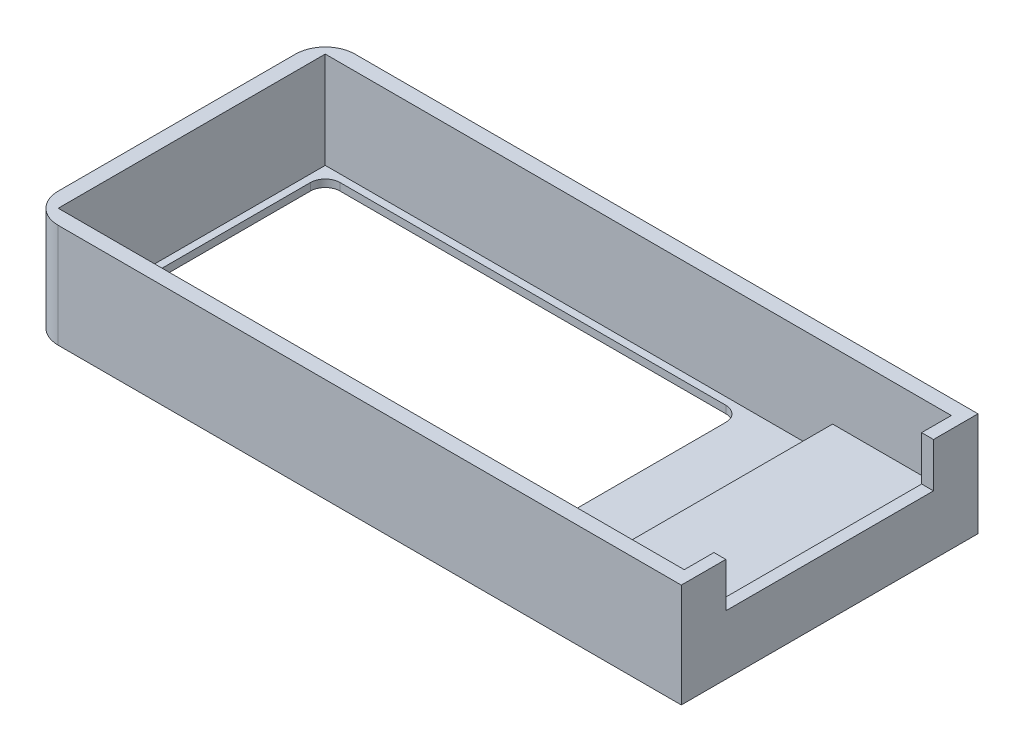
ISO-10303-21;
HEADER;
FILE_DESCRIPTION(('STEP AP214'),'2;1');
FILE_NAME('part.step','',(''),(''),'','','');
FILE_SCHEMA(('AUTOMOTIVE_DESIGN { 1 0 10303 214 1 1 1 1 }'));
ENDSEC;
DATA;
#1=APPLICATION_CONTEXT('core data for automotive mechanical design processes');
#2=APPLICATION_PROTOCOL_DEFINITION('international standard','automotive_design',2000,#1);
#3=PRODUCT_CONTEXT('',#1,'mechanical');
#4=PRODUCT('Part','Part','',(#3));
#5=PRODUCT_RELATED_PRODUCT_CATEGORY('part','',(#4));
#6=PRODUCT_DEFINITION_FORMATION('','',#4);
#7=PRODUCT_DEFINITION_CONTEXT('part definition',#1,'design');
#8=PRODUCT_DEFINITION('design','',#6,#7);
#9=PRODUCT_DEFINITION_SHAPE('','',#8);
#10=(LENGTH_UNIT() NAMED_UNIT(*) SI_UNIT(.MILLI.,.METRE.));
#11=(NAMED_UNIT(*) PLANE_ANGLE_UNIT() SI_UNIT($,.RADIAN.));
#12=(NAMED_UNIT(*) SI_UNIT($,.STERADIAN.) SOLID_ANGLE_UNIT());
#13=UNCERTAINTY_MEASURE_WITH_UNIT(LENGTH_MEASURE(1.E-05),#10,'distance_accuracy_value','');
#14=(GEOMETRIC_REPRESENTATION_CONTEXT(3) GLOBAL_UNCERTAINTY_ASSIGNED_CONTEXT((#13)) GLOBAL_UNIT_ASSIGNED_CONTEXT((#10,
#11,#12)) REPRESENTATION_CONTEXT('',''));
#15=CARTESIAN_POINT('',(0.,0.,0.));
#16=DIRECTION('',(0.,0.,1.));
#17=DIRECTION('',(1.,0.,0.));
#18=AXIS2_PLACEMENT_3D('',#15,#16,#17);
#19=CARTESIAN_POINT('',(1.,0.5,-19.));
#20=DIRECTION('',(0.,0.,-1.));
#21=DIRECTION('',(-1.,0.,0.));
#22=AXIS2_PLACEMENT_3D('',#19,#20,#21);
#23=PLANE('',#22);
#24=DIRECTION('',(0.,-1.,0.));
#25=VECTOR('',#24,1.);
#26=CARTESIAN_POINT('',(35.2,2.5,-19.));
#27=LINE('',#26,#25);
#28=CARTESIAN_POINT('',(35.2,2.5,-19.));
#29=VERTEX_POINT('',#28);
#30=CARTESIAN_POINT('',(35.2,0.5,-19.));
#31=VERTEX_POINT('',#30);
#32=EDGE_CURVE('E235',#29,#31,#27,.T.);
#33=ORIENTED_EDGE('',*,*,#32,.F.);
#34=DIRECTION('',(-1.,0.,0.));
#35=VECTOR('',#34,1.);
#36=CARTESIAN_POINT('',(35.2,2.5,-19.));
#37=LINE('',#36,#35);
#38=CARTESIAN_POINT('',(43.2,2.5,-19.));
#39=VERTEX_POINT('',#38);
#40=EDGE_CURVE('E233',#39,#29,#37,.T.);
#41=ORIENTED_EDGE('',*,*,#40,.F.);
#42=DIRECTION('',(0.,1.,0.));
#43=VECTOR('',#42,1.);
#44=CARTESIAN_POINT('',(43.2,0.5,-19.));
#45=LINE('',#44,#43);
#46=CARTESIAN_POINT('',(43.2,7.,-19.));
#47=VERTEX_POINT('',#46);
#48=EDGE_CURVE('E285',#39,#47,#45,.T.);
#49=ORIENTED_EDGE('',*,*,#48,.T.);
#50=DIRECTION('',(-1.,0.,0.));
#51=VECTOR('',#50,1.);
#52=CARTESIAN_POINT('',(1.,7.,-19.));
#53=LINE('',#52,#51);
#54=CARTESIAN_POINT('',(1.,7.,-19.));
#55=VERTEX_POINT('',#54);
#56=EDGE_CURVE('E268',#47,#55,#53,.T.);
#57=ORIENTED_EDGE('',*,*,#56,.T.);
#58=DIRECTION('',(0.,1.,0.));
#59=VECTOR('',#58,1.);
#60=CARTESIAN_POINT('',(1.,0.5,-19.));
#61=LINE('',#60,#59);
#62=CARTESIAN_POINT('',(1.,0.5,-19.));
#63=VERTEX_POINT('',#62);
#64=EDGE_CURVE('E282',#63,#55,#61,.T.);
#65=ORIENTED_EDGE('',*,*,#64,.F.);
#66=DIRECTION('',(-1.,0.,0.));
#67=VECTOR('',#66,1.);
#68=CARTESIAN_POINT('',(1.,0.5,-19.));
#69=LINE('',#68,#67);
#70=EDGE_CURVE('E271',#31,#63,#69,.T.);
#71=ORIENTED_EDGE('',*,*,#70,.F.);
#72=EDGE_LOOP('',(#33,#41,#49,#57,#65,#71));
#73=FACE_BOUND('',#72,.T.);
#74=ADVANCED_FACE('F33',(#73),#23,.F.);
#75=CARTESIAN_POINT('',(1.,0.5,-1.));
#76=DIRECTION('',(0.,0.,1.));
#77=DIRECTION('',(1.,0.,0.));
#78=AXIS2_PLACEMENT_3D('',#75,#76,#77);
#79=PLANE('',#78);
#80=DIRECTION('',(0.,-1.,0.));
#81=VECTOR('',#80,1.);
#82=CARTESIAN_POINT('',(35.2,2.5,-1.));
#83=LINE('',#82,#81);
#84=CARTESIAN_POINT('',(35.2,2.5,-1.));
#85=VERTEX_POINT('',#84);
#86=CARTESIAN_POINT('',(35.2,0.5,-1.));
#87=VERTEX_POINT('',#86);
#88=EDGE_CURVE('E239',#85,#87,#83,.T.);
#89=ORIENTED_EDGE('',*,*,#88,.T.);
#90=DIRECTION('',(1.,0.,0.));
#91=VECTOR('',#90,1.);
#92=CARTESIAN_POINT('',(1.,0.5,-1.));
#93=LINE('',#92,#91);
#94=CARTESIAN_POINT('',(1.,0.5,-1.));
#95=VERTEX_POINT('',#94);
#96=EDGE_CURVE('E267',#95,#87,#93,.T.);
#97=ORIENTED_EDGE('',*,*,#96,.F.);
#98=DIRECTION('',(0.,1.,0.));
#99=VECTOR('',#98,1.);
#100=CARTESIAN_POINT('',(1.,0.5,-1.));
#101=LINE('',#100,#99);
#102=CARTESIAN_POINT('',(1.,7.,-1.));
#103=VERTEX_POINT('',#102);
#104=EDGE_CURVE('E273',#95,#103,#101,.T.);
#105=ORIENTED_EDGE('',*,*,#104,.T.);
#106=DIRECTION('',(1.,0.,0.));
#107=VECTOR('',#106,1.);
#108=CARTESIAN_POINT('',(1.,7.,-1.));
#109=LINE('',#108,#107);
#110=CARTESIAN_POINT('',(43.2,7.,-1.));
#111=VERTEX_POINT('',#110);
#112=EDGE_CURVE('E275',#103,#111,#109,.T.);
#113=ORIENTED_EDGE('',*,*,#112,.T.);
#114=DIRECTION('',(0.,1.,0.));
#115=VECTOR('',#114,1.);
#116=CARTESIAN_POINT('',(43.2,0.5,-1.));
#117=LINE('',#116,#115);
#118=CARTESIAN_POINT('',(43.2,2.5,-1.));
#119=VERTEX_POINT('',#118);
#120=EDGE_CURVE('E288',#119,#111,#117,.T.);
#121=ORIENTED_EDGE('',*,*,#120,.F.);
#122=DIRECTION('',(1.,0.,0.));
#123=VECTOR('',#122,1.);
#124=CARTESIAN_POINT('',(35.2,2.5,-1.));
#125=LINE('',#124,#123);
#126=EDGE_CURVE('E228',#85,#119,#125,.T.);
#127=ORIENTED_EDGE('',*,*,#126,.F.);
#128=EDGE_LOOP('',(#89,#97,#105,#113,#121,#127));
#129=FACE_BOUND('',#128,.T.);
#130=ADVANCED_FACE('F409',(#129),#79,.F.);
#131=CARTESIAN_POINT('',(0.,0.5,0.));
#132=DIRECTION('',(0.,1.,0.));
#133=DIRECTION('',(0.,0.,1.));
#134=AXIS2_PLACEMENT_3D('',#131,#132,#133);
#135=PLANE('',#134);
#136=DIRECTION('',(0.,0.,1.));
#137=VECTOR('',#136,1.);
#138=CARTESIAN_POINT('',(1.5,0.5,-18.5));
#139=LINE('',#138,#137);
#140=CARTESIAN_POINT('',(1.5,0.5,-17.5));
#141=VERTEX_POINT('',#140);
#142=CARTESIAN_POINT('',(1.5,0.5,-2.5));
#143=VERTEX_POINT('',#142);
#144=EDGE_CURVE('E249',#141,#143,#139,.T.);
#145=ORIENTED_EDGE('',*,*,#144,.F.);
#146=CARTESIAN_POINT('',(2.5,0.5,-17.5));
#147=DIRECTION('',(0.,1.,0.));
#148=DIRECTION('',(0.,0.,1.));
#149=AXIS2_PLACEMENT_3D('',#146,#147,#148);
#150=CIRCLE('',#149,1.);
#151=CARTESIAN_POINT('',(2.5,0.5,-18.5));
#152=VERTEX_POINT('',#151);
#153=EDGE_CURVE('E364',#141,#152,#150,.F.);
#154=ORIENTED_EDGE('',*,*,#153,.T.);
#155=DIRECTION('',(-1.,0.,0.));
#156=VECTOR('',#155,1.);
#157=CARTESIAN_POINT('',(1.5,0.5,-18.5));
#158=LINE('',#157,#156);
#159=CARTESIAN_POINT('',(28.5,0.5,-18.5));
#160=VERTEX_POINT('',#159);
#161=EDGE_CURVE('E257',#160,#152,#158,.T.);
#162=ORIENTED_EDGE('',*,*,#161,.F.);
#163=CARTESIAN_POINT('',(28.5,0.5,-17.5));
#164=DIRECTION('',(0.,1.,0.));
#165=DIRECTION('',(0.,0.,1.));
#166=AXIS2_PLACEMENT_3D('',#163,#164,#165);
#167=CIRCLE('',#166,1.);
#168=CARTESIAN_POINT('',(29.5,0.5,-17.5));
#169=VERTEX_POINT('',#168);
#170=EDGE_CURVE('E356',#160,#169,#167,.F.);
#171=ORIENTED_EDGE('',*,*,#170,.T.);
#172=DIRECTION('',(0.,0.,-1.));
#173=VECTOR('',#172,1.);
#174=CARTESIAN_POINT('',(29.5,0.5,-18.5));
#175=LINE('',#174,#173);
#176=CARTESIAN_POINT('',(29.5,0.5,-2.5));
#177=VERTEX_POINT('',#176);
#178=EDGE_CURVE('E254',#177,#169,#175,.T.);
#179=ORIENTED_EDGE('',*,*,#178,.F.);
#180=CARTESIAN_POINT('',(28.5,0.5,-2.5));
#181=DIRECTION('',(0.,1.,0.));
#182=DIRECTION('',(0.,0.,1.));
#183=AXIS2_PLACEMENT_3D('',#180,#181,#182);
#184=CIRCLE('',#183,1.);
#185=CARTESIAN_POINT('',(28.5,0.5,-1.5));
#186=VERTEX_POINT('',#185);
#187=EDGE_CURVE('E360',#177,#186,#184,.F.);
#188=ORIENTED_EDGE('',*,*,#187,.T.);
#189=DIRECTION('',(1.,0.,0.));
#190=VECTOR('',#189,1.);
#191=CARTESIAN_POINT('',(1.5,0.5,-1.5));
#192=LINE('',#191,#190);
#193=CARTESIAN_POINT('',(2.5,0.5,-1.5));
#194=VERTEX_POINT('',#193);
#195=EDGE_CURVE('E251',#194,#186,#192,.T.);
#196=ORIENTED_EDGE('',*,*,#195,.F.);
#197=CARTESIAN_POINT('',(2.5,0.5,-2.5));
#198=DIRECTION('',(0.,1.,0.));
#199=DIRECTION('',(0.,0.,1.));
#200=AXIS2_PLACEMENT_3D('',#197,#198,#199);
#201=CIRCLE('',#200,1.);
#202=EDGE_CURVE('E41',#194,#143,#201,.F.);
#203=ORIENTED_EDGE('',*,*,#202,.T.);
#204=EDGE_LOOP('',(#145,#154,#162,#171,#179,#188,#196,#203));
#205=FACE_BOUND('',#204,.T.);
#206=ORIENTED_EDGE('',*,*,#96,.T.);
#207=DIRECTION('',(0.,0.,1.));
#208=VECTOR('',#207,1.);
#209=CARTESIAN_POINT('',(35.2,0.5,-19.));
#210=LINE('',#209,#208);
#211=EDGE_CURVE('E229',#31,#87,#210,.T.);
#212=ORIENTED_EDGE('',*,*,#211,.F.);
#213=ORIENTED_EDGE('',*,*,#70,.T.);
#214=DIRECTION('',(0.,0.,1.));
#215=VECTOR('',#214,1.);
#216=CARTESIAN_POINT('',(1.,0.5,-19.));
#217=LINE('',#216,#215);
#218=EDGE_CURVE('E264',#63,#95,#217,.T.);
#219=ORIENTED_EDGE('',*,*,#218,.T.);
#220=EDGE_LOOP('',(#206,#212,#213,#219));
#221=FACE_BOUND('',#220,.T.);
#222=ADVANCED_FACE('F369',(#205,#221),#135,.T.);
#223=CARTESIAN_POINT('',(0.,7.,0.));
#224=DIRECTION('',(1.,0.,0.));
#225=DIRECTION('',(0.,0.,-1.));
#226=AXIS2_PLACEMENT_3D('',#223,#224,#225);
#227=PLANE('',#226);
#228=DIRECTION('',(0.,0.,1.));
#229=VECTOR('',#228,1.);
#230=CARTESIAN_POINT('',(0.,7.,0.));
#231=LINE('',#230,#229);
#232=CARTESIAN_POINT('',(0.,7.,-18.));
#233=VERTEX_POINT('',#232);
#234=CARTESIAN_POINT('',(0.,7.,-2.));
#235=VERTEX_POINT('',#234);
#236=EDGE_CURVE('E292',#233,#235,#231,.T.);
#237=ORIENTED_EDGE('',*,*,#236,.F.);
#238=DIRECTION('',(0.,-1.,0.));
#239=VECTOR('',#238,1.);
#240=CARTESIAN_POINT('',(0.,7.,-18.));
#241=LINE('',#240,#239);
#242=CARTESIAN_POINT('',(0.,0.,-18.));
#243=VERTEX_POINT('',#242);
#244=EDGE_CURVE('E321',#233,#243,#241,.T.);
#245=ORIENTED_EDGE('',*,*,#244,.T.);
#246=DIRECTION('',(0.,0.,1.));
#247=VECTOR('',#246,1.);
#248=CARTESIAN_POINT('',(0.,0.,0.));
#249=LINE('',#248,#247);
#250=CARTESIAN_POINT('',(0.,0.,-2.));
#251=VERTEX_POINT('',#250);
#252=EDGE_CURVE('E284',#243,#251,#249,.T.);
#253=ORIENTED_EDGE('',*,*,#252,.T.);
#254=DIRECTION('',(0.,-1.,0.));
#255=VECTOR('',#254,1.);
#256=CARTESIAN_POINT('',(0.,7.,-2.));
#257=LINE('',#256,#255);
#258=EDGE_CURVE('E319',#251,#235,#257,.F.);
#259=ORIENTED_EDGE('',*,*,#258,.T.);
#260=EDGE_LOOP('',(#237,#245,#253,#259));
#261=FACE_BOUND('',#260,.T.);
#262=ADVANCED_FACE('F444',(#261),#227,.F.);
#263=CARTESIAN_POINT('',(0.,7.,0.));
#264=DIRECTION('',(0.,0.,-1.));
#265=DIRECTION('',(-1.,0.,0.));
#266=AXIS2_PLACEMENT_3D('',#263,#264,#265);
#267=PLANE('',#266);
#268=DIRECTION('',(1.,0.,0.));
#269=VECTOR('',#268,1.);
#270=CARTESIAN_POINT('',(0.,7.,0.));
#271=LINE('',#270,#269);
#272=CARTESIAN_POINT('',(2.,7.,0.));
#273=VERTEX_POINT('',#272);
#274=CARTESIAN_POINT('',(44.,7.,0.));
#275=VERTEX_POINT('',#274);
#276=EDGE_CURVE('E295',#273,#275,#271,.T.);
#277=ORIENTED_EDGE('',*,*,#276,.F.);
#278=DIRECTION('',(0.,-1.,0.));
#279=VECTOR('',#278,1.);
#280=CARTESIAN_POINT('',(2.,7.,0.));
#281=LINE('',#280,#279);
#282=CARTESIAN_POINT('',(2.,0.,0.));
#283=VERTEX_POINT('',#282);
#284=EDGE_CURVE('E334',#273,#283,#281,.T.);
#285=ORIENTED_EDGE('',*,*,#284,.T.);
#286=DIRECTION('',(1.,0.,0.));
#287=VECTOR('',#286,1.);
#288=CARTESIAN_POINT('',(0.,0.,0.));
#289=LINE('',#288,#287);
#290=CARTESIAN_POINT('',(44.,0.,0.));
#291=VERTEX_POINT('',#290);
#292=EDGE_CURVE('E308',#283,#291,#289,.T.);
#293=ORIENTED_EDGE('',*,*,#292,.T.);
#294=DIRECTION('',(0.,-1.,0.));
#295=VECTOR('',#294,1.);
#296=CARTESIAN_POINT('',(44.,7.,0.));
#297=LINE('',#296,#295);
#298=EDGE_CURVE('E316',#275,#291,#297,.T.);
#299=ORIENTED_EDGE('',*,*,#298,.F.);
#300=EDGE_LOOP('',(#277,#285,#293,#299));
#301=FACE_BOUND('',#300,.T.);
#302=ADVANCED_FACE('F440',(#301),#267,.F.);
#303=CARTESIAN_POINT('',(44.,7.,0.));
#304=DIRECTION('',(-1.,0.,0.));
#305=DIRECTION('',(0.,0.,1.));
#306=AXIS2_PLACEMENT_3D('',#303,#304,#305);
#307=PLANE('',#306);
#308=DIRECTION('',(0.,0.,-1.));
#309=VECTOR('',#308,1.);
#310=CARTESIAN_POINT('',(44.,7.,0.));
#311=LINE('',#310,#309);
#312=CARTESIAN_POINT('',(44.,7.,-17.));
#313=VERTEX_POINT('',#312);
#314=CARTESIAN_POINT('',(44.,7.,-20.));
#315=VERTEX_POINT('',#314);
#316=EDGE_CURVE('E298',#313,#315,#311,.T.);
#317=ORIENTED_EDGE('',*,*,#316,.F.);
#318=DIRECTION('',(0.,1.,0.));
#319=VECTOR('',#318,1.);
#320=CARTESIAN_POINT('',(44.,4.,-17.));
#321=LINE('',#320,#319);
#322=CARTESIAN_POINT('',(44.,4.,-17.));
#323=VERTEX_POINT('',#322);
#324=EDGE_CURVE('E221',#323,#313,#321,.T.);
#325=ORIENTED_EDGE('',*,*,#324,.F.);
#326=DIRECTION('',(0.,0.,-1.));
#327=VECTOR('',#326,1.);
#328=CARTESIAN_POINT('',(44.,4.,-17.));
#329=LINE('',#328,#327);
#330=CARTESIAN_POINT('',(44.,4.,-3.));
#331=VERTEX_POINT('',#330);
#332=EDGE_CURVE('E204',#331,#323,#329,.T.);
#333=ORIENTED_EDGE('',*,*,#332,.F.);
#334=DIRECTION('',(0.,1.,0.));
#335=VECTOR('',#334,1.);
#336=CARTESIAN_POINT('',(44.,4.,-3.));
#337=LINE('',#336,#335);
#338=CARTESIAN_POINT('',(44.,7.,-3.));
#339=VERTEX_POINT('',#338);
#340=EDGE_CURVE('E201',#331,#339,#337,.T.);
#341=ORIENTED_EDGE('',*,*,#340,.T.);
#342=EDGE_CURVE('E299',#275,#339,#311,.T.);
#343=ORIENTED_EDGE('',*,*,#342,.F.);
#344=ORIENTED_EDGE('',*,*,#298,.T.);
#345=DIRECTION('',(0.,0.,-1.));
#346=VECTOR('',#345,1.);
#347=CARTESIAN_POINT('',(44.,0.,0.));
#348=LINE('',#347,#346);
#349=CARTESIAN_POINT('',(44.,0.,-20.));
#350=VERTEX_POINT('',#349);
#351=EDGE_CURVE('E310',#291,#350,#348,.T.);
#352=ORIENTED_EDGE('',*,*,#351,.T.);
#353=DIRECTION('',(0.,-1.,0.));
#354=VECTOR('',#353,1.);
#355=CARTESIAN_POINT('',(44.,7.,-20.));
#356=LINE('',#355,#354);
#357=EDGE_CURVE('E305',#315,#350,#356,.T.);
#358=ORIENTED_EDGE('',*,*,#357,.F.);
#359=EDGE_LOOP('',(#317,#325,#333,#341,#343,#344,#352,#358));
#360=FACE_BOUND('',#359,.T.);
#361=ADVANCED_FACE('F436',(#360),#307,.F.);
#362=CARTESIAN_POINT('',(0.,7.,-20.));
#363=DIRECTION('',(0.,0.,1.));
#364=DIRECTION('',(1.,0.,0.));
#365=AXIS2_PLACEMENT_3D('',#362,#363,#364);
#366=PLANE('',#365);
#367=DIRECTION('',(-1.,0.,0.));
#368=VECTOR('',#367,1.);
#369=CARTESIAN_POINT('',(0.,0.,-20.));
#370=LINE('',#369,#368);
#371=CARTESIAN_POINT('',(2.,0.,-20.));
#372=VERTEX_POINT('',#371);
#373=EDGE_CURVE('E296',#350,#372,#370,.T.);
#374=ORIENTED_EDGE('',*,*,#373,.T.);
#375=DIRECTION('',(0.,-1.,0.));
#376=VECTOR('',#375,1.);
#377=CARTESIAN_POINT('',(2.,7.,-20.));
#378=LINE('',#377,#376);
#379=CARTESIAN_POINT('',(2.,7.,-20.));
#380=VERTEX_POINT('',#379);
#381=EDGE_CURVE('E328',#372,#380,#378,.F.);
#382=ORIENTED_EDGE('',*,*,#381,.T.);
#383=DIRECTION('',(-1.,0.,0.));
#384=VECTOR('',#383,1.);
#385=CARTESIAN_POINT('',(0.,7.,-20.));
#386=LINE('',#385,#384);
#387=EDGE_CURVE('E302',#315,#380,#386,.T.);
#388=ORIENTED_EDGE('',*,*,#387,.F.);
#389=ORIENTED_EDGE('',*,*,#357,.T.);
#390=EDGE_LOOP('',(#374,#382,#388,#389));
#391=FACE_BOUND('',#390,.T.);
#392=ADVANCED_FACE('F430',(#391),#366,.F.);
#393=CARTESIAN_POINT('',(0.,7.,0.));
#394=DIRECTION('',(0.,-1.,0.));
#395=DIRECTION('',(0.,0.,-1.));
#396=AXIS2_PLACEMENT_3D('',#393,#394,#395);
#397=PLANE('',#396);
#398=ORIENTED_EDGE('',*,*,#387,.T.);
#399=CARTESIAN_POINT('',(2.,7.,-18.));
#400=DIRECTION('',(0.,-1.,0.));
#401=DIRECTION('',(0.,0.,-1.));
#402=AXIS2_PLACEMENT_3D('',#399,#400,#401);
#403=CIRCLE('',#402,2.);
#404=EDGE_CURVE('E332',#380,#233,#403,.F.);
#405=ORIENTED_EDGE('',*,*,#404,.T.);
#406=ORIENTED_EDGE('',*,*,#236,.T.);
#407=CARTESIAN_POINT('',(2.,7.,-2.));
#408=DIRECTION('',(0.,-1.,0.));
#409=DIRECTION('',(0.,0.,-1.));
#410=AXIS2_PLACEMENT_3D('',#407,#408,#409);
#411=CIRCLE('',#410,2.);
#412=EDGE_CURVE('E330',#235,#273,#411,.F.);
#413=ORIENTED_EDGE('',*,*,#412,.T.);
#414=ORIENTED_EDGE('',*,*,#276,.T.);
#415=ORIENTED_EDGE('',*,*,#342,.T.);
#416=DIRECTION('',(1.,0.,0.));
#417=VECTOR('',#416,1.);
#418=CARTESIAN_POINT('',(43.2,7.,-3.));
#419=LINE('',#418,#417);
#420=CARTESIAN_POINT('',(43.2,7.,-3.));
#421=VERTEX_POINT('',#420);
#422=EDGE_CURVE('E646',#421,#339,#419,.T.);
#423=ORIENTED_EDGE('',*,*,#422,.F.);
#424=DIRECTION('',(0.,0.,-1.));
#425=VECTOR('',#424,1.);
#426=CARTESIAN_POINT('',(43.2,7.,-19.));
#427=LINE('',#426,#425);
#428=EDGE_CURVE('E219',#111,#421,#427,.T.);
#429=ORIENTED_EDGE('',*,*,#428,.F.);
#430=ORIENTED_EDGE('',*,*,#112,.F.);
#431=DIRECTION('',(0.,0.,1.));
#432=VECTOR('',#431,1.);
#433=CARTESIAN_POINT('',(1.,7.,-19.));
#434=LINE('',#433,#432);
#435=EDGE_CURVE('E263',#55,#103,#434,.T.);
#436=ORIENTED_EDGE('',*,*,#435,.F.);
#437=ORIENTED_EDGE('',*,*,#56,.F.);
#438=CARTESIAN_POINT('',(43.2,7.,-17.));
#439=VERTEX_POINT('',#438);
#440=EDGE_CURVE('E278',#439,#47,#427,.T.);
#441=ORIENTED_EDGE('',*,*,#440,.F.);
#442=DIRECTION('',(-1.,0.,0.));
#443=VECTOR('',#442,1.);
#444=CARTESIAN_POINT('',(43.2,7.,-17.));
#445=LINE('',#444,#443);
#446=EDGE_CURVE('E214',#313,#439,#445,.T.);
#447=ORIENTED_EDGE('',*,*,#446,.F.);
#448=ORIENTED_EDGE('',*,*,#316,.T.);
#449=EDGE_LOOP('',(#398,#405,#406,#413,#414,#415,#423,#429,#430,#436,#437,#441,#447,#448));
#450=FACE_BOUND('',#449,.T.);
#451=ADVANCED_FACE('F427',(#450),#397,.F.);
#452=CARTESIAN_POINT('',(0.,0.,0.));
#453=DIRECTION('',(0.,-1.,0.));
#454=DIRECTION('',(0.,0.,-1.));
#455=AXIS2_PLACEMENT_3D('',#452,#453,#454);
#456=PLANE('',#455);
#457=DIRECTION('',(-1.,0.,0.));
#458=VECTOR('',#457,1.);
#459=CARTESIAN_POINT('',(1.5,0.,-18.5));
#460=LINE('',#459,#458);
#461=CARTESIAN_POINT('',(28.5,0.,-18.5));
#462=VERTEX_POINT('',#461);
#463=CARTESIAN_POINT('',(2.5,0.,-18.5));
#464=VERTEX_POINT('',#463);
#465=EDGE_CURVE('E245',#462,#464,#460,.T.);
#466=ORIENTED_EDGE('',*,*,#465,.T.);
#467=CARTESIAN_POINT('',(2.5,0.,-17.5));
#468=DIRECTION('',(0.,-1.,0.));
#469=DIRECTION('',(0.,0.,-1.));
#470=AXIS2_PLACEMENT_3D('',#467,#468,#469);
#471=CIRCLE('',#470,1.);
#472=CARTESIAN_POINT('',(1.5,0.,-17.5));
#473=VERTEX_POINT('',#472);
#474=EDGE_CURVE('E55',#464,#473,#471,.F.);
#475=ORIENTED_EDGE('',*,*,#474,.T.);
#476=DIRECTION('',(0.,0.,1.));
#477=VECTOR('',#476,1.);
#478=CARTESIAN_POINT('',(1.5,0.,-18.5));
#479=LINE('',#478,#477);
#480=CARTESIAN_POINT('',(1.5,0.,-2.5));
#481=VERTEX_POINT('',#480);
#482=EDGE_CURVE('E247',#473,#481,#479,.T.);
#483=ORIENTED_EDGE('',*,*,#482,.T.);
#484=CARTESIAN_POINT('',(2.5,0.,-2.5));
#485=DIRECTION('',(0.,-1.,0.));
#486=DIRECTION('',(0.,0.,-1.));
#487=AXIS2_PLACEMENT_3D('',#484,#485,#486);
#488=CIRCLE('',#487,1.);
#489=CARTESIAN_POINT('',(2.5,0.,-1.5));
#490=VERTEX_POINT('',#489);
#491=EDGE_CURVE('E11',#481,#490,#488,.F.);
#492=ORIENTED_EDGE('',*,*,#491,.T.);
#493=DIRECTION('',(1.,0.,0.));
#494=VECTOR('',#493,1.);
#495=CARTESIAN_POINT('',(1.5,0.,-1.5));
#496=LINE('',#495,#494);
#497=CARTESIAN_POINT('',(28.5,0.,-1.5));
#498=VERTEX_POINT('',#497);
#499=EDGE_CURVE('E260',#490,#498,#496,.T.);
#500=ORIENTED_EDGE('',*,*,#499,.T.);
#501=CARTESIAN_POINT('',(28.5,0.,-2.5));
#502=DIRECTION('',(0.,-1.,0.));
#503=DIRECTION('',(0.,0.,-1.));
#504=AXIS2_PLACEMENT_3D('',#501,#502,#503);
#505=CIRCLE('',#504,1.);
#506=CARTESIAN_POINT('',(29.5,0.,-2.5));
#507=VERTEX_POINT('',#506);
#508=EDGE_CURVE('E362',#498,#507,#505,.F.);
#509=ORIENTED_EDGE('',*,*,#508,.T.);
#510=DIRECTION('',(0.,0.,-1.));
#511=VECTOR('',#510,1.);
#512=CARTESIAN_POINT('',(29.5,0.,-18.5));
#513=LINE('',#512,#511);
#514=CARTESIAN_POINT('',(29.5,0.,-17.5));
#515=VERTEX_POINT('',#514);
#516=EDGE_CURVE('E242',#507,#515,#513,.T.);
#517=ORIENTED_EDGE('',*,*,#516,.T.);
#518=CARTESIAN_POINT('',(28.5,0.,-17.5));
#519=DIRECTION('',(0.,-1.,0.));
#520=DIRECTION('',(0.,0.,-1.));
#521=AXIS2_PLACEMENT_3D('',#518,#519,#520);
#522=CIRCLE('',#521,1.);
#523=EDGE_CURVE('E358',#515,#462,#522,.F.);
#524=ORIENTED_EDGE('',*,*,#523,.T.);
#525=EDGE_LOOP('',(#466,#475,#483,#492,#500,#509,#517,#524));
#526=FACE_BOUND('',#525,.T.);
#527=ORIENTED_EDGE('',*,*,#252,.F.);
#528=CARTESIAN_POINT('',(2.,0.,-18.));
#529=DIRECTION('',(0.,-1.,0.));
#530=DIRECTION('',(0.,0.,-1.));
#531=AXIS2_PLACEMENT_3D('',#528,#529,#530);
#532=CIRCLE('',#531,2.);
#533=EDGE_CURVE('E326',#243,#372,#532,.T.);
#534=ORIENTED_EDGE('',*,*,#533,.T.);
#535=ORIENTED_EDGE('',*,*,#373,.F.);
#536=ORIENTED_EDGE('',*,*,#351,.F.);
#537=ORIENTED_EDGE('',*,*,#292,.F.);
#538=CARTESIAN_POINT('',(2.,0.,-2.));
#539=DIRECTION('',(0.,-1.,0.));
#540=DIRECTION('',(0.,0.,-1.));
#541=AXIS2_PLACEMENT_3D('',#538,#539,#540);
#542=CIRCLE('',#541,2.);
#543=EDGE_CURVE('E324',#283,#251,#542,.T.);
#544=ORIENTED_EDGE('',*,*,#543,.T.);
#545=EDGE_LOOP('',(#527,#534,#535,#536,#537,#544));
#546=FACE_BOUND('',#545,.T.);
#547=ADVANCED_FACE('F377',(#526,#546),#456,.T.);
#548=CARTESIAN_POINT('',(1.,0.5,-19.));
#549=DIRECTION('',(-1.,0.,0.));
#550=DIRECTION('',(0.,0.,1.));
#551=AXIS2_PLACEMENT_3D('',#548,#549,#550);
#552=PLANE('',#551);
#553=ORIENTED_EDGE('',*,*,#435,.T.);
#554=ORIENTED_EDGE('',*,*,#104,.F.);
#555=ORIENTED_EDGE('',*,*,#218,.F.);
#556=ORIENTED_EDGE('',*,*,#64,.T.);
#557=EDGE_LOOP('',(#553,#554,#555,#556));
#558=FACE_BOUND('',#557,.T.);
#559=ADVANCED_FACE('F422',(#558),#552,.F.);
#560=CARTESIAN_POINT('',(43.2,0.5,-19.));
#561=DIRECTION('',(1.,0.,0.));
#562=DIRECTION('',(0.,0.,-1.));
#563=AXIS2_PLACEMENT_3D('',#560,#561,#562);
#564=PLANE('',#563);
#565=DIRECTION('',(0.,0.,1.));
#566=VECTOR('',#565,1.);
#567=CARTESIAN_POINT('',(43.2,4.,-17.));
#568=LINE('',#567,#566);
#569=CARTESIAN_POINT('',(43.2,4.,-17.));
#570=VERTEX_POINT('',#569);
#571=CARTESIAN_POINT('',(43.2,4.,-3.));
#572=VERTEX_POINT('',#571);
#573=EDGE_CURVE('E205',#570,#572,#568,.T.);
#574=ORIENTED_EDGE('',*,*,#573,.F.);
#575=DIRECTION('',(0.,1.,0.));
#576=VECTOR('',#575,1.);
#577=CARTESIAN_POINT('',(43.2,4.,-17.));
#578=LINE('',#577,#576);
#579=EDGE_CURVE('E237',#570,#439,#578,.T.);
#580=ORIENTED_EDGE('',*,*,#579,.T.);
#581=ORIENTED_EDGE('',*,*,#440,.T.);
#582=ORIENTED_EDGE('',*,*,#48,.F.);
#583=DIRECTION('',(0.,0.,-1.));
#584=VECTOR('',#583,1.);
#585=CARTESIAN_POINT('',(43.2,2.5,-19.));
#586=LINE('',#585,#584);
#587=EDGE_CURVE('E231',#119,#39,#586,.T.);
#588=ORIENTED_EDGE('',*,*,#587,.F.);
#589=ORIENTED_EDGE('',*,*,#120,.T.);
#590=ORIENTED_EDGE('',*,*,#428,.T.);
#591=DIRECTION('',(0.,1.,0.));
#592=VECTOR('',#591,1.);
#593=CARTESIAN_POINT('',(43.2,4.,-3.));
#594=LINE('',#593,#592);
#595=EDGE_CURVE('E198',#572,#421,#594,.T.);
#596=ORIENTED_EDGE('',*,*,#595,.F.);
#597=EDGE_LOOP('',(#574,#580,#581,#582,#588,#589,#590,#596));
#598=FACE_BOUND('',#597,.T.);
#599=ADVANCED_FACE('F217',(#598),#564,.F.);
#600=CARTESIAN_POINT('',(1.5,-0.00100000000000002,-18.5));
#601=DIRECTION('',(-1.,0.,0.));
#602=DIRECTION('',(0.,0.,1.));
#603=AXIS2_PLACEMENT_3D('',#600,#601,#602);
#604=PLANE('',#603);
#605=ORIENTED_EDGE('',*,*,#482,.F.);
#606=DIRECTION('',(0.,1.,0.));
#607=VECTOR('',#606,1.);
#608=CARTESIAN_POINT('',(1.5,0.5,-17.5));
#609=LINE('',#608,#607);
#610=EDGE_CURVE('E353',#473,#141,#609,.T.);
#611=ORIENTED_EDGE('',*,*,#610,.T.);
#612=ORIENTED_EDGE('',*,*,#144,.T.);
#613=DIRECTION('',(0.,1.,0.));
#614=VECTOR('',#613,1.);
#615=CARTESIAN_POINT('',(1.5,0.,-2.5));
#616=LINE('',#615,#614);
#617=EDGE_CURVE('E48',#143,#481,#616,.F.);
#618=ORIENTED_EDGE('',*,*,#617,.T.);
#619=EDGE_LOOP('',(#605,#611,#612,#618));
#620=FACE_BOUND('',#619,.T.);
#621=ADVANCED_FACE('F373',(#620),#604,.F.);
#622=CARTESIAN_POINT('',(1.5,-0.00100000000000002,-18.5));
#623=DIRECTION('',(0.,0.,-1.));
#624=DIRECTION('',(-1.,0.,0.));
#625=AXIS2_PLACEMENT_3D('',#622,#623,#624);
#626=PLANE('',#625);
#627=ORIENTED_EDGE('',*,*,#465,.F.);
#628=DIRECTION('',(0.,1.,0.));
#629=VECTOR('',#628,1.);
#630=CARTESIAN_POINT('',(28.5,0.5,-18.5));
#631=LINE('',#630,#629);
#632=EDGE_CURVE('E339',#462,#160,#631,.T.);
#633=ORIENTED_EDGE('',*,*,#632,.T.);
#634=ORIENTED_EDGE('',*,*,#161,.T.);
#635=DIRECTION('',(0.,1.,0.));
#636=VECTOR('',#635,1.);
#637=CARTESIAN_POINT('',(2.5,0.,-18.5));
#638=LINE('',#637,#636);
#639=EDGE_CURVE('E337',#152,#464,#638,.F.);
#640=ORIENTED_EDGE('',*,*,#639,.T.);
#641=EDGE_LOOP('',(#627,#633,#634,#640));
#642=FACE_BOUND('',#641,.T.);
#643=ADVANCED_FACE('F397',(#642),#626,.F.);
#644=CARTESIAN_POINT('',(29.5,-0.00100000000000002,-18.5));
#645=DIRECTION('',(1.,0.,0.));
#646=DIRECTION('',(0.,0.,-1.));
#647=AXIS2_PLACEMENT_3D('',#644,#645,#646);
#648=PLANE('',#647);
#649=ORIENTED_EDGE('',*,*,#178,.T.);
#650=DIRECTION('',(0.,1.,0.));
#651=VECTOR('',#650,1.);
#652=CARTESIAN_POINT('',(29.5,0.,-17.5));
#653=LINE('',#652,#651);
#654=EDGE_CURVE('E345',#169,#515,#653,.F.);
#655=ORIENTED_EDGE('',*,*,#654,.T.);
#656=ORIENTED_EDGE('',*,*,#516,.F.);
#657=DIRECTION('',(0.,1.,0.));
#658=VECTOR('',#657,1.);
#659=CARTESIAN_POINT('',(29.5,0.5,-2.5));
#660=LINE('',#659,#658);
#661=EDGE_CURVE('E342',#507,#177,#660,.T.);
#662=ORIENTED_EDGE('',*,*,#661,.T.);
#663=EDGE_LOOP('',(#649,#655,#656,#662));
#664=FACE_BOUND('',#663,.T.);
#665=ADVANCED_FACE('F389',(#664),#648,.F.);
#666=CARTESIAN_POINT('',(1.5,-0.00100000000000002,-1.5));
#667=DIRECTION('',(0.,0.,1.));
#668=DIRECTION('',(1.,0.,0.));
#669=AXIS2_PLACEMENT_3D('',#666,#667,#668);
#670=PLANE('',#669);
#671=ORIENTED_EDGE('',*,*,#195,.T.);
#672=DIRECTION('',(0.,1.,0.));
#673=VECTOR('',#672,1.);
#674=CARTESIAN_POINT('',(28.5,0.,-1.5));
#675=LINE('',#674,#673);
#676=EDGE_CURVE('E350',#186,#498,#675,.F.);
#677=ORIENTED_EDGE('',*,*,#676,.T.);
#678=ORIENTED_EDGE('',*,*,#499,.F.);
#679=DIRECTION('',(0.,1.,0.));
#680=VECTOR('',#679,1.);
#681=CARTESIAN_POINT('',(2.5,0.5,-1.5));
#682=LINE('',#681,#680);
#683=EDGE_CURVE('E347',#490,#194,#682,.T.);
#684=ORIENTED_EDGE('',*,*,#683,.T.);
#685=EDGE_LOOP('',(#671,#677,#678,#684));
#686=FACE_BOUND('',#685,.T.);
#687=ADVANCED_FACE('F381',(#686),#670,.F.);
#688=CARTESIAN_POINT('',(35.2,2.5,-19.));
#689=DIRECTION('',(1.,0.,0.));
#690=DIRECTION('',(0.,0.,-1.));
#691=AXIS2_PLACEMENT_3D('',#688,#689,#690);
#692=PLANE('',#691);
#693=ORIENTED_EDGE('',*,*,#211,.T.);
#694=ORIENTED_EDGE('',*,*,#88,.F.);
#695=DIRECTION('',(0.,0.,1.));
#696=VECTOR('',#695,1.);
#697=CARTESIAN_POINT('',(35.2,2.5,-19.));
#698=LINE('',#697,#696);
#699=EDGE_CURVE('E226',#29,#85,#698,.T.);
#700=ORIENTED_EDGE('',*,*,#699,.F.);
#701=ORIENTED_EDGE('',*,*,#32,.T.);
#702=EDGE_LOOP('',(#693,#694,#700,#701));
#703=FACE_BOUND('',#702,.T.);
#704=ADVANCED_FACE('F526',(#703),#692,.F.);
#705=CARTESIAN_POINT('',(0.,2.5,0.));
#706=DIRECTION('',(0.,1.,0.));
#707=DIRECTION('',(0.,0.,1.));
#708=AXIS2_PLACEMENT_3D('',#705,#706,#707);
#709=PLANE('',#708);
#710=ORIENTED_EDGE('',*,*,#699,.T.);
#711=ORIENTED_EDGE('',*,*,#126,.T.);
#712=ORIENTED_EDGE('',*,*,#587,.T.);
#713=ORIENTED_EDGE('',*,*,#40,.T.);
#714=EDGE_LOOP('',(#710,#711,#712,#713));
#715=FACE_BOUND('',#714,.T.);
#716=ADVANCED_FACE('F516',(#715),#709,.T.);
#717=CARTESIAN_POINT('',(43.2,4.,-17.));
#718=DIRECTION('',(0.,0.,-1.));
#719=DIRECTION('',(-1.,0.,0.));
#720=AXIS2_PLACEMENT_3D('',#717,#718,#719);
#721=PLANE('',#720);
#722=ORIENTED_EDGE('',*,*,#446,.T.);
#723=ORIENTED_EDGE('',*,*,#579,.F.);
#724=DIRECTION('',(-1.,0.,0.));
#725=VECTOR('',#724,1.);
#726=CARTESIAN_POINT('',(43.2,4.,-17.));
#727=LINE('',#726,#725);
#728=EDGE_CURVE('E210',#323,#570,#727,.T.);
#729=ORIENTED_EDGE('',*,*,#728,.F.);
#730=ORIENTED_EDGE('',*,*,#324,.T.);
#731=EDGE_LOOP('',(#722,#723,#729,#730));
#732=FACE_BOUND('',#731,.T.);
#733=ADVANCED_FACE('F508',(#732),#721,.F.);
#734=CARTESIAN_POINT('',(43.2,4.,-3.));
#735=DIRECTION('',(0.,0.,1.));
#736=DIRECTION('',(1.,0.,0.));
#737=AXIS2_PLACEMENT_3D('',#734,#735,#736);
#738=PLANE('',#737);
#739=ORIENTED_EDGE('',*,*,#422,.T.);
#740=ORIENTED_EDGE('',*,*,#340,.F.);
#741=DIRECTION('',(1.,0.,0.));
#742=VECTOR('',#741,1.);
#743=CARTESIAN_POINT('',(43.2,4.,-3.));
#744=LINE('',#743,#742);
#745=EDGE_CURVE('E194',#572,#331,#744,.T.);
#746=ORIENTED_EDGE('',*,*,#745,.F.);
#747=ORIENTED_EDGE('',*,*,#595,.T.);
#748=EDGE_LOOP('',(#739,#740,#746,#747));
#749=FACE_BOUND('',#748,.T.);
#750=ADVANCED_FACE('F196',(#749),#738,.F.);
#751=CARTESIAN_POINT('',(0.,4.,0.));
#752=DIRECTION('',(0.,1.,0.));
#753=DIRECTION('',(0.,0.,1.));
#754=AXIS2_PLACEMENT_3D('',#751,#752,#753);
#755=PLANE('',#754);
#756=ORIENTED_EDGE('',*,*,#573,.T.);
#757=ORIENTED_EDGE('',*,*,#745,.T.);
#758=ORIENTED_EDGE('',*,*,#332,.T.);
#759=ORIENTED_EDGE('',*,*,#728,.T.);
#760=EDGE_LOOP('',(#756,#757,#758,#759));
#761=FACE_BOUND('',#760,.T.);
#762=ADVANCED_FACE('F208',(#761),#755,.T.);
#763=CARTESIAN_POINT('',(2.,7.,-18.));
#764=DIRECTION('',(0.,-1.,0.));
#765=DIRECTION('',(0.,0.,-1.));
#766=AXIS2_PLACEMENT_3D('',#763,#764,#765);
#767=CYLINDRICAL_SURFACE('',#766,2.);
#768=ORIENTED_EDGE('',*,*,#404,.F.);
#769=ORIENTED_EDGE('',*,*,#381,.F.);
#770=ORIENTED_EDGE('',*,*,#533,.F.);
#771=ORIENTED_EDGE('',*,*,#244,.F.);
#772=EDGE_LOOP('',(#768,#769,#770,#771));
#773=FACE_BOUND('',#772,.T.);
#774=ADVANCED_FACE('F449',(#773),#767,.T.);
#775=CARTESIAN_POINT('',(2.,7.,-2.));
#776=DIRECTION('',(0.,-1.,0.));
#777=DIRECTION('',(0.,0.,-1.));
#778=AXIS2_PLACEMENT_3D('',#775,#776,#777);
#779=CYLINDRICAL_SURFACE('',#778,2.);
#780=ORIENTED_EDGE('',*,*,#412,.F.);
#781=ORIENTED_EDGE('',*,*,#258,.F.);
#782=ORIENTED_EDGE('',*,*,#543,.F.);
#783=ORIENTED_EDGE('',*,*,#284,.F.);
#784=EDGE_LOOP('',(#780,#781,#782,#783));
#785=FACE_BOUND('',#784,.T.);
#786=ADVANCED_FACE('F452',(#785),#779,.T.);
#787=CARTESIAN_POINT('',(28.5,-0.00100000000000002,-17.5));
#788=DIRECTION('',(0.,-1.,0.));
#789=DIRECTION('',(0.,0.,-1.));
#790=AXIS2_PLACEMENT_3D('',#787,#788,#789);
#791=CYLINDRICAL_SURFACE('',#790,1.);
#792=ORIENTED_EDGE('',*,*,#523,.F.);
#793=ORIENTED_EDGE('',*,*,#654,.F.);
#794=ORIENTED_EDGE('',*,*,#170,.F.);
#795=ORIENTED_EDGE('',*,*,#632,.F.);
#796=EDGE_LOOP('',(#792,#793,#794,#795));
#797=FACE_BOUND('',#796,.T.);
#798=ADVANCED_FACE('F393',(#797),#791,.F.);
#799=CARTESIAN_POINT('',(28.5,-0.00100000000000002,-2.5));
#800=DIRECTION('',(0.,-1.,0.));
#801=DIRECTION('',(0.,0.,-1.));
#802=AXIS2_PLACEMENT_3D('',#799,#800,#801);
#803=CYLINDRICAL_SURFACE('',#802,1.);
#804=ORIENTED_EDGE('',*,*,#508,.F.);
#805=ORIENTED_EDGE('',*,*,#676,.F.);
#806=ORIENTED_EDGE('',*,*,#187,.F.);
#807=ORIENTED_EDGE('',*,*,#661,.F.);
#808=EDGE_LOOP('',(#804,#805,#806,#807));
#809=FACE_BOUND('',#808,.T.);
#810=ADVANCED_FACE('F384',(#809),#803,.F.);
#811=CARTESIAN_POINT('',(2.5,-0.00100000000000002,-17.5));
#812=DIRECTION('',(0.,-1.,0.));
#813=DIRECTION('',(0.,0.,-1.));
#814=AXIS2_PLACEMENT_3D('',#811,#812,#813);
#815=CYLINDRICAL_SURFACE('',#814,1.);
#816=ORIENTED_EDGE('',*,*,#474,.F.);
#817=ORIENTED_EDGE('',*,*,#639,.F.);
#818=ORIENTED_EDGE('',*,*,#153,.F.);
#819=ORIENTED_EDGE('',*,*,#610,.F.);
#820=EDGE_LOOP('',(#816,#817,#818,#819));
#821=FACE_BOUND('',#820,.T.);
#822=ADVANCED_FACE('F401',(#821),#815,.F.);
#823=CARTESIAN_POINT('',(2.5,-0.00100000000000002,-2.5));
#824=DIRECTION('',(0.,-1.,0.));
#825=DIRECTION('',(0.,0.,-1.));
#826=AXIS2_PLACEMENT_3D('',#823,#824,#825);
#827=CYLINDRICAL_SURFACE('',#826,1.);
#828=ORIENTED_EDGE('',*,*,#491,.F.);
#829=ORIENTED_EDGE('',*,*,#617,.F.);
#830=ORIENTED_EDGE('',*,*,#202,.F.);
#831=ORIENTED_EDGE('',*,*,#683,.F.);
#832=EDGE_LOOP('',(#828,#829,#830,#831));
#833=FACE_BOUND('',#832,.T.);
#834=ADVANCED_FACE('F35',(#833),#827,.F.);
#835=CLOSED_SHELL('',(#74,#130,#222,#262,#302,#361,#392,#451,#547,#559,#599,#621,#643,#665,#687,
#704,#716,#733,#750,#762,#774,#786,#798,#810,#822,#834));
#836=MANIFOLD_SOLID_BREP('B2',#835);
#837=ADVANCED_BREP_SHAPE_REPRESENTATION('',(#18,#836),#14);
#838=SHAPE_DEFINITION_REPRESENTATION(#9,#837);
ENDSEC;
END-ISO-10303-21;
